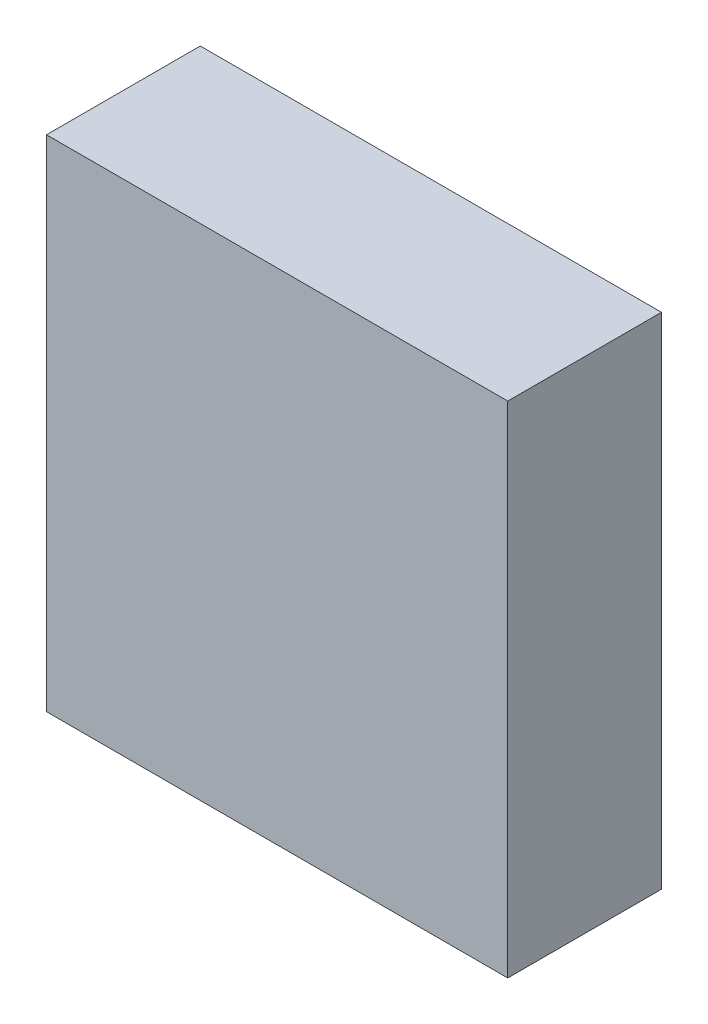
ISO-10303-21;
HEADER;
FILE_DESCRIPTION(('STEP AP214'),'2;1');
FILE_NAME('part.step','',(''),(''),'','','');
FILE_SCHEMA(('AUTOMOTIVE_DESIGN { 1 0 10303 214 1 1 1 1 }'));
ENDSEC;
DATA;
#1=APPLICATION_CONTEXT('core data for automotive mechanical design processes');
#2=APPLICATION_PROTOCOL_DEFINITION('international standard','automotive_design',2000,#1);
#3=PRODUCT_CONTEXT('',#1,'mechanical');
#4=PRODUCT('Part','Part','',(#3));
#5=PRODUCT_RELATED_PRODUCT_CATEGORY('part','',(#4));
#6=PRODUCT_DEFINITION_FORMATION('','',#4);
#7=PRODUCT_DEFINITION_CONTEXT('part definition',#1,'design');
#8=PRODUCT_DEFINITION('design','',#6,#7);
#9=PRODUCT_DEFINITION_SHAPE('','',#8);
#10=(LENGTH_UNIT() NAMED_UNIT(*) SI_UNIT(.MILLI.,.METRE.));
#11=(NAMED_UNIT(*) PLANE_ANGLE_UNIT() SI_UNIT($,.RADIAN.));
#12=(NAMED_UNIT(*) SI_UNIT($,.STERADIAN.) SOLID_ANGLE_UNIT());
#13=UNCERTAINTY_MEASURE_WITH_UNIT(LENGTH_MEASURE(1.E-05),#10,'distance_accuracy_value','');
#14=(GEOMETRIC_REPRESENTATION_CONTEXT(3) GLOBAL_UNCERTAINTY_ASSIGNED_CONTEXT((#13)) GLOBAL_UNIT_ASSIGNED_CONTEXT((#10,
#11,#12)) REPRESENTATION_CONTEXT('',''));
#15=CARTESIAN_POINT('',(0.,0.,0.));
#16=DIRECTION('',(0.,0.,1.));
#17=DIRECTION('',(1.,0.,0.));
#18=AXIS2_PLACEMENT_3D('',#15,#16,#17);
#19=CARTESIAN_POINT('',(0.,1981.2,0.));
#20=DIRECTION('',(1.,0.,0.));
#21=DIRECTION('',(0.,0.,-1.));
#22=AXIS2_PLACEMENT_3D('',#19,#20,#21);
#23=PLANE('',#22);
#24=DIRECTION('',(0.,0.,1.));
#25=VECTOR('',#24,1.);
#26=CARTESIAN_POINT('',(0.,0.,0.));
#27=LINE('',#26,#25);
#28=CARTESIAN_POINT('',(0.,0.,-609.6));
#29=VERTEX_POINT('',#28);
#30=CARTESIAN_POINT('',(0.,0.,0.));
#31=VERTEX_POINT('',#30);
#32=EDGE_CURVE('E107',#29,#31,#27,.T.);
#33=ORIENTED_EDGE('',*,*,#32,.T.);
#34=DIRECTION('',(0.,-1.,0.));
#35=VECTOR('',#34,1.);
#36=CARTESIAN_POINT('',(0.,1981.2,0.));
#37=LINE('',#36,#35);
#38=CARTESIAN_POINT('',(0.,1981.2,0.));
#39=VERTEX_POINT('',#38);
#40=EDGE_CURVE('E11',#39,#31,#37,.T.);
#41=ORIENTED_EDGE('',*,*,#40,.F.);
#42=DIRECTION('',(0.,0.,1.));
#43=VECTOR('',#42,1.);
#44=CARTESIAN_POINT('',(0.,1981.2,0.));
#45=LINE('',#44,#43);
#46=CARTESIAN_POINT('',(0.,1981.2,-609.6));
#47=VERTEX_POINT('',#46);
#48=EDGE_CURVE('E91',#47,#39,#45,.T.);
#49=ORIENTED_EDGE('',*,*,#48,.F.);
#50=DIRECTION('',(0.,-1.,0.));
#51=VECTOR('',#50,1.);
#52=CARTESIAN_POINT('',(0.,1981.2,-609.6));
#53=LINE('',#52,#51);
#54=EDGE_CURVE('E103',#47,#29,#53,.T.);
#55=ORIENTED_EDGE('',*,*,#54,.T.);
#56=EDGE_LOOP('',(#33,#41,#49,#55));
#57=FACE_BOUND('',#56,.T.);
#58=ADVANCED_FACE('F39',(#57),#23,.F.);
#59=CARTESIAN_POINT('',(0.,1981.2,0.));
#60=DIRECTION('',(0.,0.,-1.));
#61=DIRECTION('',(-1.,0.,0.));
#62=AXIS2_PLACEMENT_3D('',#59,#60,#61);
#63=PLANE('',#62);
#64=DIRECTION('',(1.,0.,0.));
#65=VECTOR('',#64,1.);
#66=CARTESIAN_POINT('',(0.,0.,0.));
#67=LINE('',#66,#65);
#68=CARTESIAN_POINT('',(1828.8,0.,0.));
#69=VERTEX_POINT('',#68);
#70=EDGE_CURVE('E96',#31,#69,#67,.T.);
#71=ORIENTED_EDGE('',*,*,#70,.T.);
#72=DIRECTION('',(0.,-1.,0.));
#73=VECTOR('',#72,1.);
#74=CARTESIAN_POINT('',(1828.8,1981.2,0.));
#75=LINE('',#74,#73);
#76=CARTESIAN_POINT('',(1828.8,1981.2,0.));
#77=VERTEX_POINT('',#76);
#78=EDGE_CURVE('E48',#77,#69,#75,.T.);
#79=ORIENTED_EDGE('',*,*,#78,.F.);
#80=DIRECTION('',(1.,0.,0.));
#81=VECTOR('',#80,1.);
#82=CARTESIAN_POINT('',(0.,1981.2,0.));
#83=LINE('',#82,#81);
#84=EDGE_CURVE('E86',#39,#77,#83,.T.);
#85=ORIENTED_EDGE('',*,*,#84,.F.);
#86=ORIENTED_EDGE('',*,*,#40,.T.);
#87=EDGE_LOOP('',(#71,#79,#85,#86));
#88=FACE_BOUND('',#87,.T.);
#89=ADVANCED_FACE('F95',(#88),#63,.F.);
#90=CARTESIAN_POINT('',(1828.8,1981.2,0.));
#91=DIRECTION('',(-1.,0.,0.));
#92=DIRECTION('',(0.,0.,1.));
#93=AXIS2_PLACEMENT_3D('',#90,#91,#92);
#94=PLANE('',#93);
#95=DIRECTION('',(0.,0.,-1.));
#96=VECTOR('',#95,1.);
#97=CARTESIAN_POINT('',(1828.8,0.,0.));
#98=LINE('',#97,#96);
#99=CARTESIAN_POINT('',(1828.8,0.,-609.6));
#100=VERTEX_POINT('',#99);
#101=EDGE_CURVE('E73',#69,#100,#98,.T.);
#102=ORIENTED_EDGE('',*,*,#101,.T.);
#103=DIRECTION('',(0.,-1.,0.));
#104=VECTOR('',#103,1.);
#105=CARTESIAN_POINT('',(1828.8,1981.2,-609.6));
#106=LINE('',#105,#104);
#107=CARTESIAN_POINT('',(1828.8,1981.2,-609.6));
#108=VERTEX_POINT('',#107);
#109=EDGE_CURVE('E98',#108,#100,#106,.T.);
#110=ORIENTED_EDGE('',*,*,#109,.F.);
#111=DIRECTION('',(0.,0.,-1.));
#112=VECTOR('',#111,1.);
#113=CARTESIAN_POINT('',(1828.8,1981.2,0.));
#114=LINE('',#113,#112);
#115=EDGE_CURVE('E89',#77,#108,#114,.T.);
#116=ORIENTED_EDGE('',*,*,#115,.F.);
#117=ORIENTED_EDGE('',*,*,#78,.T.);
#118=EDGE_LOOP('',(#102,#110,#116,#117));
#119=FACE_BOUND('',#118,.T.);
#120=ADVANCED_FACE('F99',(#119),#94,.F.);
#121=CARTESIAN_POINT('',(0.,1981.2,-609.6));
#122=DIRECTION('',(0.,0.,1.));
#123=DIRECTION('',(1.,0.,0.));
#124=AXIS2_PLACEMENT_3D('',#121,#122,#123);
#125=PLANE('',#124);
#126=DIRECTION('',(-1.,0.,0.));
#127=VECTOR('',#126,1.);
#128=CARTESIAN_POINT('',(0.,0.,-609.6));
#129=LINE('',#128,#127);
#130=EDGE_CURVE('E79',#100,#29,#129,.T.);
#131=ORIENTED_EDGE('',*,*,#130,.T.);
#132=ORIENTED_EDGE('',*,*,#54,.F.);
#133=DIRECTION('',(-1.,0.,0.));
#134=VECTOR('',#133,1.);
#135=CARTESIAN_POINT('',(0.,1981.2,-609.6));
#136=LINE('',#135,#134);
#137=EDGE_CURVE('E56',#108,#47,#136,.T.);
#138=ORIENTED_EDGE('',*,*,#137,.F.);
#139=ORIENTED_EDGE('',*,*,#109,.T.);
#140=EDGE_LOOP('',(#131,#132,#138,#139));
#141=FACE_BOUND('',#140,.T.);
#142=ADVANCED_FACE('F120',(#141),#125,.F.);
#143=CARTESIAN_POINT('',(0.,1981.2,0.));
#144=DIRECTION('',(0.,-1.,0.));
#145=DIRECTION('',(0.,0.,-1.));
#146=AXIS2_PLACEMENT_3D('',#143,#144,#145);
#147=PLANE('',#146);
#148=ORIENTED_EDGE('',*,*,#48,.T.);
#149=ORIENTED_EDGE('',*,*,#84,.T.);
#150=ORIENTED_EDGE('',*,*,#115,.T.);
#151=ORIENTED_EDGE('',*,*,#137,.T.);
#152=EDGE_LOOP('',(#148,#149,#150,#151));
#153=FACE_BOUND('',#152,.T.);
#154=ADVANCED_FACE('F87',(#153),#147,.F.);
#155=CARTESIAN_POINT('',(0.,0.,0.));
#156=DIRECTION('',(0.,-1.,0.));
#157=DIRECTION('',(0.,0.,-1.));
#158=AXIS2_PLACEMENT_3D('',#155,#156,#157);
#159=PLANE('',#158);
#160=ORIENTED_EDGE('',*,*,#32,.F.);
#161=ORIENTED_EDGE('',*,*,#130,.F.);
#162=ORIENTED_EDGE('',*,*,#101,.F.);
#163=ORIENTED_EDGE('',*,*,#70,.F.);
#164=EDGE_LOOP('',(#160,#161,#162,#163));
#165=FACE_BOUND('',#164,.T.);
#166=ADVANCED_FACE('F123',(#165),#159,.T.);
#167=CLOSED_SHELL('',(#58,#89,#120,#142,#154,#166));
#168=MANIFOLD_SOLID_BREP('B2',#167);
#169=ADVANCED_BREP_SHAPE_REPRESENTATION('',(#18,#168),#14);
#170=SHAPE_DEFINITION_REPRESENTATION(#9,#169);
ENDSEC;
END-ISO-10303-21;
